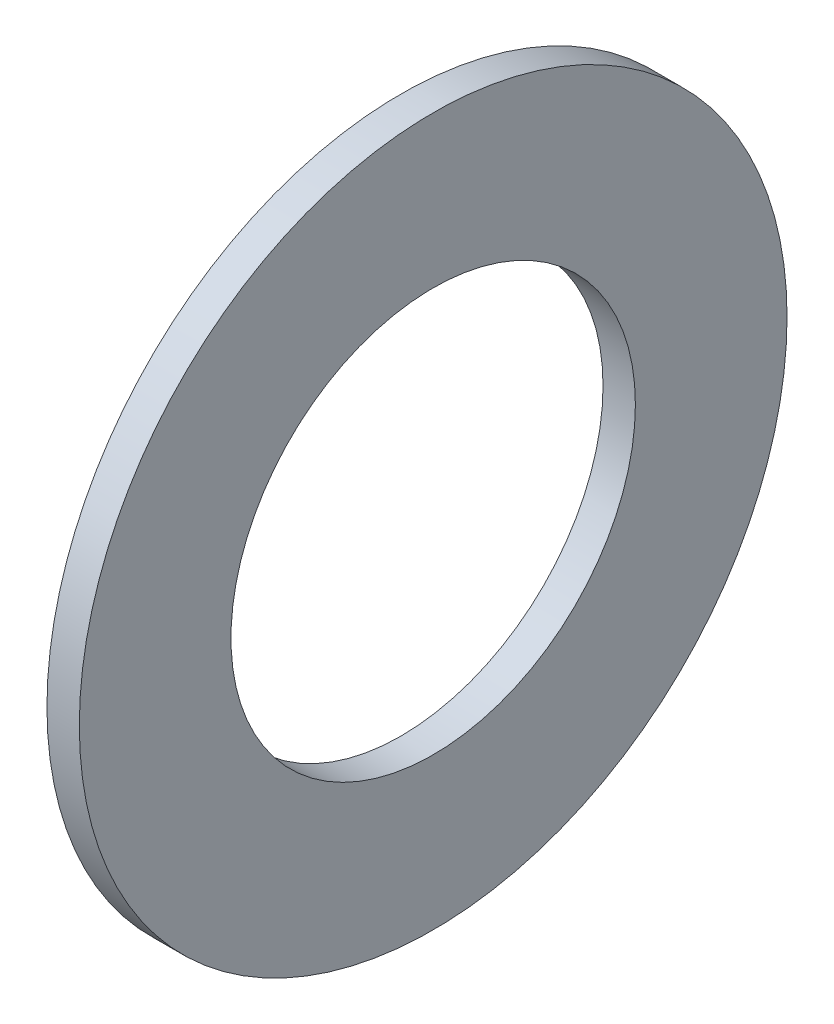
ISO-10303-21;
HEADER;
FILE_DESCRIPTION(('STEP AP214'),'2;1');
FILE_NAME('part.step','',(''),(''),'','','');
FILE_SCHEMA(('AUTOMOTIVE_DESIGN { 1 0 10303 214 1 1 1 1 }'));
ENDSEC;
DATA;
#1=APPLICATION_CONTEXT('core data for automotive mechanical design processes');
#2=APPLICATION_PROTOCOL_DEFINITION('international standard','automotive_design',2000,#1);
#3=PRODUCT_CONTEXT('',#1,'mechanical');
#4=PRODUCT('Part','Part','',(#3));
#5=PRODUCT_RELATED_PRODUCT_CATEGORY('part','',(#4));
#6=PRODUCT_DEFINITION_FORMATION('','',#4);
#7=PRODUCT_DEFINITION_CONTEXT('part definition',#1,'design');
#8=PRODUCT_DEFINITION('design','',#6,#7);
#9=PRODUCT_DEFINITION_SHAPE('','',#8);
#10=(LENGTH_UNIT() NAMED_UNIT(*) SI_UNIT(.MILLI.,.METRE.));
#11=(NAMED_UNIT(*) PLANE_ANGLE_UNIT() SI_UNIT($,.RADIAN.));
#12=(NAMED_UNIT(*) SI_UNIT($,.STERADIAN.) SOLID_ANGLE_UNIT());
#13=UNCERTAINTY_MEASURE_WITH_UNIT(LENGTH_MEASURE(1.E-05),#10,'distance_accuracy_value','');
#14=(GEOMETRIC_REPRESENTATION_CONTEXT(3) GLOBAL_UNCERTAINTY_ASSIGNED_CONTEXT((#13)) GLOBAL_UNIT_ASSIGNED_CONTEXT((#10,
#11,#12)) REPRESENTATION_CONTEXT('',''));
#15=CARTESIAN_POINT('',(0.,0.,0.));
#16=DIRECTION('',(0.,0.,1.));
#17=DIRECTION('',(1.,0.,0.));
#18=AXIS2_PLACEMENT_3D('',#15,#16,#17);
#19=CARTESIAN_POINT('',(0.8,-17.8250860154988,17.5));
#20=DIRECTION('',(1.,0.,0.));
#21=DIRECTION('',(0.,0.,-1.));
#22=AXIS2_PLACEMENT_3D('',#19,#20,#21);
#23=PLANE('',#22);
#24=CARTESIAN_POINT('',(0.8,0.,0.));
#25=DIRECTION('',(1.,0.,0.));
#26=DIRECTION('',(0.,0.,1.));
#27=AXIS2_PLACEMENT_3D('',#24,#25,#26);
#28=CIRCLE('',#27,17.5);
#29=CARTESIAN_POINT('',(0.8,0.,17.5));
#30=VERTEX_POINT('',#29);
#31=EDGE_CURVE('E30',#30,#30,#28,.T.);
#32=ORIENTED_EDGE('',*,*,#31,.T.);
#33=EDGE_LOOP('',(#32));
#34=FACE_BOUND('',#33,.T.);
#35=CARTESIAN_POINT('',(0.8,0.,0.));
#36=DIRECTION('',(-1.,0.,0.));
#37=DIRECTION('',(0.,-1.16857528098535E-09,-1.));
#38=AXIS2_PLACEMENT_3D('',#35,#36,#37);
#39=CIRCLE('',#38,10.);
#40=CARTESIAN_POINT('',(0.8,-1.16857528098535E-08,-10.));
#41=VERTEX_POINT('',#40);
#42=EDGE_CURVE('E26',#41,#41,#39,.F.);
#43=ORIENTED_EDGE('',*,*,#42,.F.);
#44=EDGE_LOOP('',(#43));
#45=FACE_BOUND('',#44,.T.);
#46=ADVANCED_FACE('F15',(#34,#45),#23,.T.);
#47=CARTESIAN_POINT('',(-0.8,-17.8250860051984,17.5));
#48=DIRECTION('',(-1.,0.,0.));
#49=DIRECTION('',(0.,1.,0.));
#50=AXIS2_PLACEMENT_3D('',#47,#48,#49);
#51=PLANE('',#50);
#52=CARTESIAN_POINT('',(-0.8,0.,0.));
#53=DIRECTION('',(-1.,0.,0.));
#54=DIRECTION('',(0.,0.,-1.));
#55=AXIS2_PLACEMENT_3D('',#52,#53,#54);
#56=CIRCLE('',#55,17.5);
#57=CARTESIAN_POINT('',(-0.8,0.,-17.5));
#58=VERTEX_POINT('',#57);
#59=EDGE_CURVE('E22',#58,#58,#56,.F.);
#60=ORIENTED_EDGE('',*,*,#59,.F.);
#61=EDGE_LOOP('',(#60));
#62=FACE_BOUND('',#61,.T.);
#63=CARTESIAN_POINT('',(-0.8,0.,0.));
#64=DIRECTION('',(1.,0.,0.));
#65=DIRECTION('',(0.,0.,1.));
#66=AXIS2_PLACEMENT_3D('',#63,#64,#65);
#67=CIRCLE('',#66,10.);
#68=CARTESIAN_POINT('',(-0.8,0.,10.));
#69=VERTEX_POINT('',#68);
#70=EDGE_CURVE('E10',#69,#69,#67,.T.);
#71=ORIENTED_EDGE('',*,*,#70,.T.);
#72=EDGE_LOOP('',(#71));
#73=FACE_BOUND('',#72,.T.);
#74=ADVANCED_FACE('F44',(#62,#73),#51,.T.);
#75=CARTESIAN_POINT('',(0.8,0.,0.));
#76=DIRECTION('',(-1.,0.,0.));
#77=DIRECTION('',(0.,1.16842991982488E-09,-1.));
#78=AXIS2_PLACEMENT_3D('',#75,#76,#77);
#79=CYLINDRICAL_SURFACE('',#78,10.);
#80=ORIENTED_EDGE('',*,*,#42,.T.);
#81=EDGE_LOOP('',(#80));
#82=FACE_BOUND('',#81,.T.);
#83=ORIENTED_EDGE('',*,*,#70,.F.);
#84=EDGE_LOOP('',(#83));
#85=FACE_BOUND('',#84,.T.);
#86=ADVANCED_FACE('F39',(#82,#85),#79,.F.);
#87=CARTESIAN_POINT('',(0.8,0.,0.));
#88=DIRECTION('',(-1.,0.,0.));
#89=DIRECTION('',(0.,0.,-1.));
#90=AXIS2_PLACEMENT_3D('',#87,#88,#89);
#91=CYLINDRICAL_SURFACE('',#90,17.5);
#92=ORIENTED_EDGE('',*,*,#31,.F.);
#93=EDGE_LOOP('',(#92));
#94=FACE_BOUND('',#93,.T.);
#95=ORIENTED_EDGE('',*,*,#59,.T.);
#96=EDGE_LOOP('',(#95));
#97=FACE_BOUND('',#96,.T.);
#98=ADVANCED_FACE('F17',(#94,#97),#91,.T.);
#99=CLOSED_SHELL('',(#46,#74,#86,#98));
#100=MANIFOLD_SOLID_BREP('B1',#99);
#101=ADVANCED_BREP_SHAPE_REPRESENTATION('',(#18,#100),#14);
#102=SHAPE_DEFINITION_REPRESENTATION(#9,#101);
ENDSEC;
END-ISO-10303-21;
